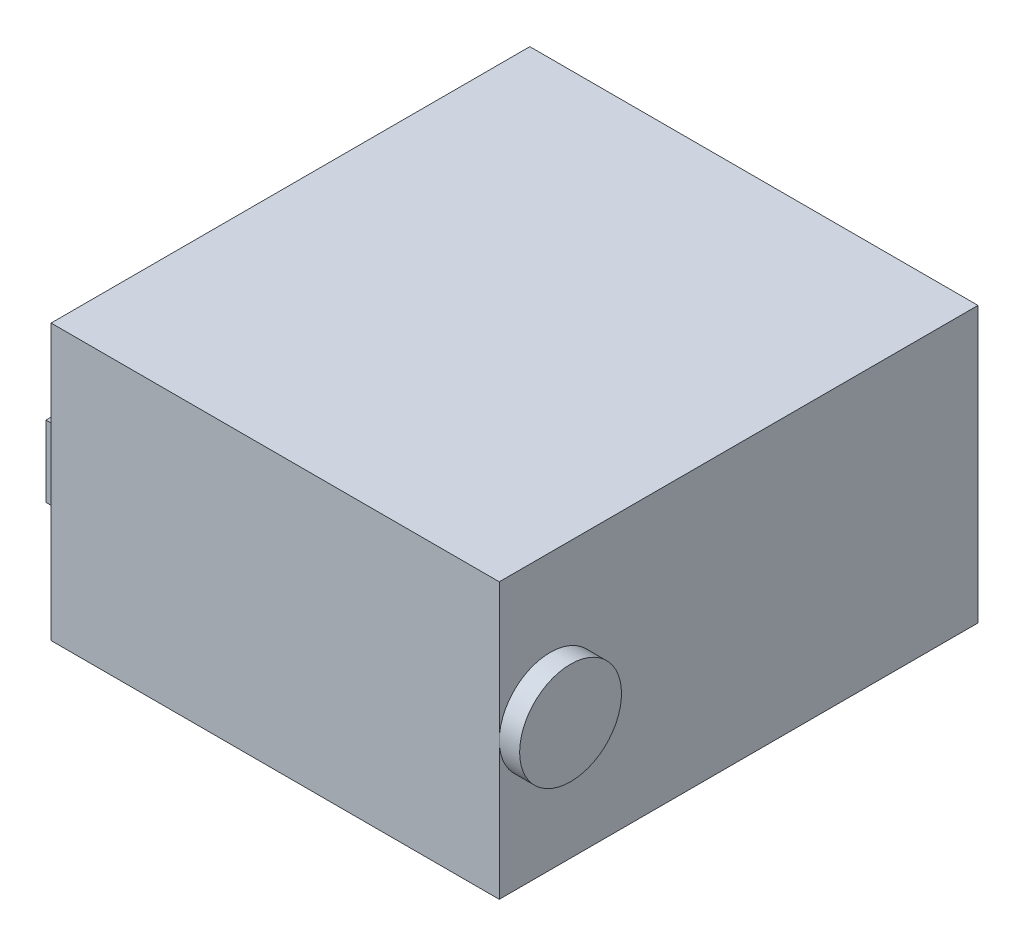
ISO-10303-21;
HEADER;
FILE_DESCRIPTION(('STEP AP214'),'2;1');
FILE_NAME('part.step','',(''),(''),'','','');
FILE_SCHEMA(('AUTOMOTIVE_DESIGN { 1 0 10303 214 1 1 1 1 }'));
ENDSEC;
DATA;
#1=APPLICATION_CONTEXT('core data for automotive mechanical design processes');
#2=APPLICATION_PROTOCOL_DEFINITION('international standard','automotive_design',2000,#1);
#3=PRODUCT_CONTEXT('',#1,'mechanical');
#4=PRODUCT('Part','Part','',(#3));
#5=PRODUCT_RELATED_PRODUCT_CATEGORY('part','',(#4));
#6=PRODUCT_DEFINITION_FORMATION('','',#4);
#7=PRODUCT_DEFINITION_CONTEXT('part definition',#1,'design');
#8=PRODUCT_DEFINITION('design','',#6,#7);
#9=PRODUCT_DEFINITION_SHAPE('','',#8);
#10=(LENGTH_UNIT() NAMED_UNIT(*) SI_UNIT(.MILLI.,.METRE.));
#11=(NAMED_UNIT(*) PLANE_ANGLE_UNIT() SI_UNIT($,.RADIAN.));
#12=(NAMED_UNIT(*) SI_UNIT($,.STERADIAN.) SOLID_ANGLE_UNIT());
#13=UNCERTAINTY_MEASURE_WITH_UNIT(LENGTH_MEASURE(1.E-05),#10,'distance_accuracy_value','');
#14=(GEOMETRIC_REPRESENTATION_CONTEXT(3) GLOBAL_UNCERTAINTY_ASSIGNED_CONTEXT((#13)) GLOBAL_UNIT_ASSIGNED_CONTEXT((#10,
#11,#12)) REPRESENTATION_CONTEXT('',''));
#15=CARTESIAN_POINT('',(0.,0.,0.));
#16=DIRECTION('',(0.,0.,1.));
#17=DIRECTION('',(1.,0.,0.));
#18=AXIS2_PLACEMENT_3D('',#15,#16,#17);
#19=CARTESIAN_POINT('',(0.,85.725,0.));
#20=DIRECTION('',(1.,0.,0.));
#21=DIRECTION('',(0.,0.,-1.));
#22=AXIS2_PLACEMENT_3D('',#19,#20,#21);
#23=PLANE('',#22);
#24=DIRECTION('',(0.,0.,1.));
#25=VECTOR('',#24,1.);
#26=CARTESIAN_POINT('',(0.,0.,0.));
#27=LINE('',#26,#25);
#28=CARTESIAN_POINT('',(0.,0.,-149.225));
#29=VERTEX_POINT('',#28);
#30=CARTESIAN_POINT('',(0.,0.,0.));
#31=VERTEX_POINT('',#30);
#32=EDGE_CURVE('E132',#29,#31,#27,.T.);
#33=ORIENTED_EDGE('',*,*,#32,.T.);
#34=DIRECTION('',(0.,-1.,0.));
#35=VECTOR('',#34,1.);
#36=CARTESIAN_POINT('',(0.,85.725,0.));
#37=LINE('',#36,#35);
#38=CARTESIAN_POINT('',(0.,85.725,0.));
#39=VERTEX_POINT('',#38);
#40=EDGE_CURVE('E11',#39,#31,#37,.T.);
#41=ORIENTED_EDGE('',*,*,#40,.F.);
#42=DIRECTION('',(0.,0.,1.));
#43=VECTOR('',#42,1.);
#44=CARTESIAN_POINT('',(0.,85.725,0.));
#45=LINE('',#44,#43);
#46=CARTESIAN_POINT('',(0.,85.725,-149.225));
#47=VERTEX_POINT('',#46);
#48=EDGE_CURVE('E130',#47,#39,#45,.T.);
#49=ORIENTED_EDGE('',*,*,#48,.F.);
#50=DIRECTION('',(0.,-1.,0.));
#51=VECTOR('',#50,1.);
#52=CARTESIAN_POINT('',(0.,85.725,-149.225));
#53=LINE('',#52,#51);
#54=EDGE_CURVE('E116',#47,#29,#53,.T.);
#55=ORIENTED_EDGE('',*,*,#54,.T.);
#56=EDGE_LOOP('',(#33,#41,#49,#55));
#57=FACE_BOUND('',#56,.T.);
#58=DIRECTION('',(0.,-1.,0.));
#59=VECTOR('',#58,1.);
#60=CARTESIAN_POINT('',(0.,53.975,-53.975));
#61=LINE('',#60,#59);
#62=CARTESIAN_POINT('',(0.,53.975,-53.975));
#63=VERTEX_POINT('',#62);
#64=CARTESIAN_POINT('',(0.,31.75,-53.975));
#65=VERTEX_POINT('',#64);
#66=EDGE_CURVE('E52',#63,#65,#61,.T.);
#67=ORIENTED_EDGE('',*,*,#66,.F.);
#68=DIRECTION('',(0.,0.,-1.));
#69=VECTOR('',#68,1.);
#70=CARTESIAN_POINT('',(0.,53.975,-53.975));
#71=LINE('',#70,#69);
#72=CARTESIAN_POINT('',(0.,53.975,-4.7625));
#73=VERTEX_POINT('',#72);
#74=EDGE_CURVE('E60',#73,#63,#71,.T.);
#75=ORIENTED_EDGE('',*,*,#74,.F.);
#76=DIRECTION('',(0.,1.,0.));
#77=VECTOR('',#76,1.);
#78=CARTESIAN_POINT('',(0.,53.975,-4.7625));
#79=LINE('',#78,#77);
#80=CARTESIAN_POINT('',(0.,31.75,-4.7625));
#81=VERTEX_POINT('',#80);
#82=EDGE_CURVE('E154',#81,#73,#79,.T.);
#83=ORIENTED_EDGE('',*,*,#82,.F.);
#84=DIRECTION('',(0.,0.,1.));
#85=VECTOR('',#84,1.);
#86=CARTESIAN_POINT('',(0.,31.75,-53.975));
#87=LINE('',#86,#85);
#88=EDGE_CURVE('E160',#65,#81,#87,.T.);
#89=ORIENTED_EDGE('',*,*,#88,.F.);
#90=EDGE_LOOP('',(#67,#75,#83,#89));
#91=FACE_BOUND('',#90,.T.);
#92=ADVANCED_FACE('F39',(#57,#91),#23,.F.);
#93=CARTESIAN_POINT('',(0.,85.725,0.));
#94=DIRECTION('',(0.,0.,-1.));
#95=DIRECTION('',(-1.,0.,0.));
#96=AXIS2_PLACEMENT_3D('',#93,#94,#95);
#97=PLANE('',#96);
#98=DIRECTION('',(1.,0.,0.));
#99=VECTOR('',#98,1.);
#100=CARTESIAN_POINT('',(0.,0.,0.));
#101=LINE('',#100,#99);
#102=CARTESIAN_POINT('',(139.7,0.,0.));
#103=VERTEX_POINT('',#102);
#104=EDGE_CURVE('E113',#31,#103,#101,.T.);
#105=ORIENTED_EDGE('',*,*,#104,.T.);
#106=DIRECTION('',(0.,-1.,0.));
#107=VECTOR('',#106,1.);
#108=CARTESIAN_POINT('',(139.7,85.725,0.));
#109=LINE('',#108,#107);
#110=CARTESIAN_POINT('',(139.7,42.8625,0.));
#111=VERTEX_POINT('',#110);
#112=EDGE_CURVE('E115',#111,#103,#109,.T.);
#113=ORIENTED_EDGE('',*,*,#112,.F.);
#114=CARTESIAN_POINT('',(139.7,85.725,0.));
#115=VERTEX_POINT('',#114);
#116=EDGE_CURVE('E46',#115,#111,#109,.T.);
#117=ORIENTED_EDGE('',*,*,#116,.F.);
#118=DIRECTION('',(1.,0.,0.));
#119=VECTOR('',#118,1.);
#120=CARTESIAN_POINT('',(0.,85.725,0.));
#121=LINE('',#120,#119);
#122=EDGE_CURVE('E140',#39,#115,#121,.T.);
#123=ORIENTED_EDGE('',*,*,#122,.F.);
#124=ORIENTED_EDGE('',*,*,#40,.T.);
#125=EDGE_LOOP('',(#105,#113,#117,#123,#124));
#126=FACE_BOUND('',#125,.T.);
#127=ADVANCED_FACE('F111',(#126),#97,.F.);
#128=CARTESIAN_POINT('',(139.7,85.725,0.));
#129=DIRECTION('',(-1.,0.,0.));
#130=DIRECTION('',(0.,0.,1.));
#131=AXIS2_PLACEMENT_3D('',#128,#129,#130);
#132=PLANE('',#131);
#133=ORIENTED_EDGE('',*,*,#116,.T.);
#134=CARTESIAN_POINT('',(139.7,42.8625,-15.875));
#135=DIRECTION('',(1.,0.,0.));
#136=DIRECTION('',(0.,0.,-1.));
#137=AXIS2_PLACEMENT_3D('',#134,#135,#136);
#138=CIRCLE('',#137,15.875);
#139=EDGE_CURVE('E107',#111,#111,#138,.T.);
#140=ORIENTED_EDGE('',*,*,#139,.F.);
#141=ORIENTED_EDGE('',*,*,#112,.T.);
#142=DIRECTION('',(0.,0.,-1.));
#143=VECTOR('',#142,1.);
#144=CARTESIAN_POINT('',(139.7,0.,0.));
#145=LINE('',#144,#143);
#146=CARTESIAN_POINT('',(139.7,0.,-149.225));
#147=VERTEX_POINT('',#146);
#148=EDGE_CURVE('E126',#103,#147,#145,.T.);
#149=ORIENTED_EDGE('',*,*,#148,.T.);
#150=DIRECTION('',(0.,-1.,0.));
#151=VECTOR('',#150,1.);
#152=CARTESIAN_POINT('',(139.7,85.725,-149.225));
#153=LINE('',#152,#151);
#154=CARTESIAN_POINT('',(139.7,85.725,-149.225));
#155=VERTEX_POINT('',#154);
#156=EDGE_CURVE('E120',#155,#147,#153,.T.);
#157=ORIENTED_EDGE('',*,*,#156,.F.);
#158=DIRECTION('',(0.,0.,-1.));
#159=VECTOR('',#158,1.);
#160=CARTESIAN_POINT('',(139.7,85.725,0.));
#161=LINE('',#160,#159);
#162=EDGE_CURVE('E109',#115,#155,#161,.T.);
#163=ORIENTED_EDGE('',*,*,#162,.F.);
#164=EDGE_LOOP('',(#133,#140,#141,#149,#157,#163));
#165=FACE_BOUND('',#164,.T.);
#166=ADVANCED_FACE('F106',(#165),#132,.F.);
#167=CARTESIAN_POINT('',(0.,85.725,-149.225));
#168=DIRECTION('',(0.,0.,1.));
#169=DIRECTION('',(1.,0.,0.));
#170=AXIS2_PLACEMENT_3D('',#167,#168,#169);
#171=PLANE('',#170);
#172=DIRECTION('',(-1.,0.,0.));
#173=VECTOR('',#172,1.);
#174=CARTESIAN_POINT('',(0.,0.,-149.225));
#175=LINE('',#174,#173);
#176=EDGE_CURVE('E123',#147,#29,#175,.T.);
#177=ORIENTED_EDGE('',*,*,#176,.T.);
#178=ORIENTED_EDGE('',*,*,#54,.F.);
#179=DIRECTION('',(-1.,0.,0.));
#180=VECTOR('',#179,1.);
#181=CARTESIAN_POINT('',(0.,85.725,-149.225));
#182=LINE('',#181,#180);
#183=EDGE_CURVE('E121',#155,#47,#182,.T.);
#184=ORIENTED_EDGE('',*,*,#183,.F.);
#185=ORIENTED_EDGE('',*,*,#156,.T.);
#186=EDGE_LOOP('',(#177,#178,#184,#185));
#187=FACE_BOUND('',#186,.T.);
#188=ADVANCED_FACE('F210',(#187),#171,.F.);
#189=CARTESIAN_POINT('',(0.,85.725,0.));
#190=DIRECTION('',(0.,-1.,0.));
#191=DIRECTION('',(0.,0.,-1.));
#192=AXIS2_PLACEMENT_3D('',#189,#190,#191);
#193=PLANE('',#192);
#194=ORIENTED_EDGE('',*,*,#48,.T.);
#195=ORIENTED_EDGE('',*,*,#122,.T.);
#196=ORIENTED_EDGE('',*,*,#162,.T.);
#197=ORIENTED_EDGE('',*,*,#183,.T.);
#198=EDGE_LOOP('',(#194,#195,#196,#197));
#199=FACE_BOUND('',#198,.T.);
#200=ADVANCED_FACE('F204',(#199),#193,.F.);
#201=CARTESIAN_POINT('',(0.,0.,0.));
#202=DIRECTION('',(0.,-1.,0.));
#203=DIRECTION('',(0.,0.,-1.));
#204=AXIS2_PLACEMENT_3D('',#201,#202,#203);
#205=PLANE('',#204);
#206=ORIENTED_EDGE('',*,*,#32,.F.);
#207=ORIENTED_EDGE('',*,*,#176,.F.);
#208=ORIENTED_EDGE('',*,*,#148,.F.);
#209=ORIENTED_EDGE('',*,*,#104,.F.);
#210=EDGE_LOOP('',(#206,#207,#208,#209));
#211=FACE_BOUND('',#210,.T.);
#212=ADVANCED_FACE('F205',(#211),#205,.T.);
#213=CARTESIAN_POINT('',(-6.35,53.975,-53.975));
#214=DIRECTION('',(0.,0.,1.));
#215=DIRECTION('',(1.,0.,0.));
#216=AXIS2_PLACEMENT_3D('',#213,#214,#215);
#217=PLANE('',#216);
#218=ORIENTED_EDGE('',*,*,#66,.T.);
#219=DIRECTION('',(1.,0.,0.));
#220=VECTOR('',#219,1.);
#221=CARTESIAN_POINT('',(-6.35,31.75,-53.975));
#222=LINE('',#221,#220);
#223=CARTESIAN_POINT('',(-6.35,31.75,-53.975));
#224=VERTEX_POINT('',#223);
#225=EDGE_CURVE('E131',#224,#65,#222,.T.);
#226=ORIENTED_EDGE('',*,*,#225,.F.);
#227=DIRECTION('',(0.,-1.,0.));
#228=VECTOR('',#227,1.);
#229=CARTESIAN_POINT('',(-6.35,53.975,-53.975));
#230=LINE('',#229,#228);
#231=CARTESIAN_POINT('',(-6.35,53.975,-53.975));
#232=VERTEX_POINT('',#231);
#233=EDGE_CURVE('E152',#232,#224,#230,.T.);
#234=ORIENTED_EDGE('',*,*,#233,.F.);
#235=DIRECTION('',(1.,0.,0.));
#236=VECTOR('',#235,1.);
#237=CARTESIAN_POINT('',(-6.35,53.975,-53.975));
#238=LINE('',#237,#236);
#239=EDGE_CURVE('E149',#232,#63,#238,.T.);
#240=ORIENTED_EDGE('',*,*,#239,.T.);
#241=EDGE_LOOP('',(#218,#226,#234,#240));
#242=FACE_BOUND('',#241,.T.);
#243=ADVANCED_FACE('F216',(#242),#217,.F.);
#244=CARTESIAN_POINT('',(-6.35,31.75,-53.975));
#245=DIRECTION('',(0.,1.,0.));
#246=DIRECTION('',(0.,0.,1.));
#247=AXIS2_PLACEMENT_3D('',#244,#245,#246);
#248=PLANE('',#247);
#249=ORIENTED_EDGE('',*,*,#88,.T.);
#250=DIRECTION('',(1.,0.,0.));
#251=VECTOR('',#250,1.);
#252=CARTESIAN_POINT('',(-6.35,31.75,-4.7625));
#253=LINE('',#252,#251);
#254=CARTESIAN_POINT('',(-6.35,31.75,-4.7625));
#255=VERTEX_POINT('',#254);
#256=EDGE_CURVE('E141',#255,#81,#253,.T.);
#257=ORIENTED_EDGE('',*,*,#256,.F.);
#258=DIRECTION('',(0.,0.,1.));
#259=VECTOR('',#258,1.);
#260=CARTESIAN_POINT('',(-6.35,31.75,-53.975));
#261=LINE('',#260,#259);
#262=EDGE_CURVE('E164',#224,#255,#261,.T.);
#263=ORIENTED_EDGE('',*,*,#262,.F.);
#264=ORIENTED_EDGE('',*,*,#225,.T.);
#265=EDGE_LOOP('',(#249,#257,#263,#264));
#266=FACE_BOUND('',#265,.T.);
#267=ADVANCED_FACE('F218',(#266),#248,.F.);
#268=CARTESIAN_POINT('',(-6.35,53.975,-4.7625));
#269=DIRECTION('',(0.,0.,-1.));
#270=DIRECTION('',(-1.,0.,0.));
#271=AXIS2_PLACEMENT_3D('',#268,#269,#270);
#272=PLANE('',#271);
#273=ORIENTED_EDGE('',*,*,#82,.T.);
#274=DIRECTION('',(1.,0.,0.));
#275=VECTOR('',#274,1.);
#276=CARTESIAN_POINT('',(-6.35,53.975,-4.7625));
#277=LINE('',#276,#275);
#278=CARTESIAN_POINT('',(-6.35,53.975,-4.7625));
#279=VERTEX_POINT('',#278);
#280=EDGE_CURVE('E148',#279,#73,#277,.T.);
#281=ORIENTED_EDGE('',*,*,#280,.F.);
#282=DIRECTION('',(0.,1.,0.));
#283=VECTOR('',#282,1.);
#284=CARTESIAN_POINT('',(-6.35,53.975,-4.7625));
#285=LINE('',#284,#283);
#286=EDGE_CURVE('E162',#255,#279,#285,.T.);
#287=ORIENTED_EDGE('',*,*,#286,.F.);
#288=ORIENTED_EDGE('',*,*,#256,.T.);
#289=EDGE_LOOP('',(#273,#281,#287,#288));
#290=FACE_BOUND('',#289,.T.);
#291=ADVANCED_FACE('F224',(#290),#272,.F.);
#292=CARTESIAN_POINT('',(-6.35,53.975,-53.975));
#293=DIRECTION('',(0.,-1.,0.));
#294=DIRECTION('',(0.,0.,-1.));
#295=AXIS2_PLACEMENT_3D('',#292,#293,#294);
#296=PLANE('',#295);
#297=ORIENTED_EDGE('',*,*,#74,.T.);
#298=ORIENTED_EDGE('',*,*,#239,.F.);
#299=DIRECTION('',(0.,0.,-1.));
#300=VECTOR('',#299,1.);
#301=CARTESIAN_POINT('',(-6.35,53.975,-53.975));
#302=LINE('',#301,#300);
#303=EDGE_CURVE('E155',#279,#232,#302,.T.);
#304=ORIENTED_EDGE('',*,*,#303,.F.);
#305=ORIENTED_EDGE('',*,*,#280,.T.);
#306=EDGE_LOOP('',(#297,#298,#304,#305));
#307=FACE_BOUND('',#306,.T.);
#308=ADVANCED_FACE('F187',(#307),#296,.F.);
#309=CARTESIAN_POINT('',(-6.35,0.,0.));
#310=DIRECTION('',(-1.,0.,0.));
#311=DIRECTION('',(0.,0.,1.));
#312=AXIS2_PLACEMENT_3D('',#309,#310,#311);
#313=PLANE('',#312);
#314=ORIENTED_EDGE('',*,*,#233,.T.);
#315=ORIENTED_EDGE('',*,*,#262,.T.);
#316=ORIENTED_EDGE('',*,*,#286,.T.);
#317=ORIENTED_EDGE('',*,*,#303,.T.);
#318=EDGE_LOOP('',(#314,#315,#316,#317));
#319=FACE_BOUND('',#318,.T.);
#320=ADVANCED_FACE('F179',(#319),#313,.T.);
#321=CARTESIAN_POINT('',(146.05,42.8625,-15.875));
#322=DIRECTION('',(-1.,0.,0.));
#323=DIRECTION('',(0.,0.,1.));
#324=AXIS2_PLACEMENT_3D('',#321,#322,#323);
#325=CYLINDRICAL_SURFACE('',#324,15.875);
#326=CARTESIAN_POINT('',(146.05,42.8625,-15.875));
#327=DIRECTION('',(1.,0.,0.));
#328=DIRECTION('',(0.,0.,-1.));
#329=AXIS2_PLACEMENT_3D('',#326,#327,#328);
#330=CIRCLE('',#329,15.875);
#331=CARTESIAN_POINT('',(146.05,42.8625,-31.75));
#332=VERTEX_POINT('',#331);
#333=EDGE_CURVE('E161',#332,#332,#330,.T.);
#334=ORIENTED_EDGE('',*,*,#333,.F.);
#335=EDGE_LOOP('',(#334));
#336=FACE_BOUND('',#335,.T.);
#337=ORIENTED_EDGE('',*,*,#139,.T.);
#338=EDGE_LOOP('',(#337));
#339=FACE_BOUND('',#338,.T.);
#340=ADVANCED_FACE('F173',(#336,#339),#325,.T.);
#341=CARTESIAN_POINT('',(146.05,42.8625,-15.875));
#342=DIRECTION('',(1.,0.,0.));
#343=DIRECTION('',(0.,0.,-1.));
#344=AXIS2_PLACEMENT_3D('',#341,#342,#343);
#345=PLANE('',#344);
#346=ORIENTED_EDGE('',*,*,#333,.T.);
#347=EDGE_LOOP('',(#346));
#348=FACE_BOUND('',#347,.T.);
#349=ADVANCED_FACE('F174',(#348),#345,.T.);
#350=CLOSED_SHELL('',(#92,#127,#166,#188,#200,#212,#243,#267,#291,#308,#320,#340,#349));
#351=MANIFOLD_SOLID_BREP('B2',#350);
#352=ADVANCED_BREP_SHAPE_REPRESENTATION('',(#18,#351),#14);
#353=SHAPE_DEFINITION_REPRESENTATION(#9,#352);
ENDSEC;
END-ISO-10303-21;
